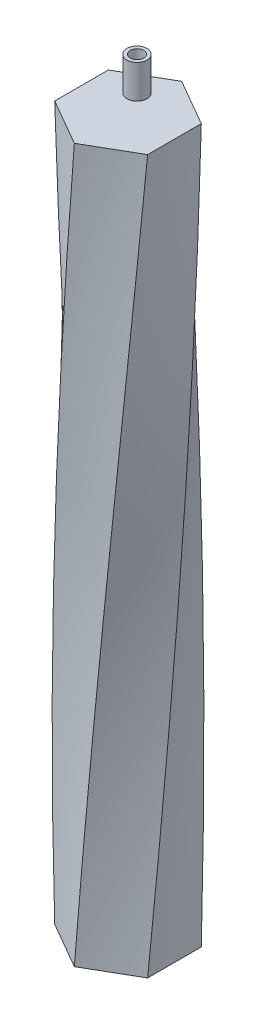
ISO-10303-21;
HEADER;
FILE_DESCRIPTION(('STEP AP214'),'2;1');
FILE_NAME('part.step','',(''),(''),'','','');
FILE_SCHEMA(('AUTOMOTIVE_DESIGN { 1 0 10303 214 1 1 1 1 }'));
ENDSEC;
DATA;
#1=APPLICATION_CONTEXT('core data for automotive mechanical design processes');
#2=APPLICATION_PROTOCOL_DEFINITION('international standard','automotive_design',2000,#1);
#3=PRODUCT_CONTEXT('',#1,'mechanical');
#4=PRODUCT('Part','Part','',(#3));
#5=PRODUCT_RELATED_PRODUCT_CATEGORY('part','',(#4));
#6=PRODUCT_DEFINITION_FORMATION('','',#4);
#7=PRODUCT_DEFINITION_CONTEXT('part definition',#1,'design');
#8=PRODUCT_DEFINITION('design','',#6,#7);
#9=PRODUCT_DEFINITION_SHAPE('','',#8);
#10=(LENGTH_UNIT() NAMED_UNIT(*) SI_UNIT(.MILLI.,.METRE.));
#11=(NAMED_UNIT(*) PLANE_ANGLE_UNIT() SI_UNIT($,.RADIAN.));
#12=(NAMED_UNIT(*) SI_UNIT($,.STERADIAN.) SOLID_ANGLE_UNIT());
#13=UNCERTAINTY_MEASURE_WITH_UNIT(LENGTH_MEASURE(1.E-05),#10,'distance_accuracy_value','');
#14=(GEOMETRIC_REPRESENTATION_CONTEXT(3) GLOBAL_UNCERTAINTY_ASSIGNED_CONTEXT((#13)) GLOBAL_UNIT_ASSIGNED_CONTEXT((#10,
#11,#12)) REPRESENTATION_CONTEXT('',''));
#15=CARTESIAN_POINT('',(0.,0.,0.));
#16=DIRECTION('',(0.,0.,1.));
#17=DIRECTION('',(1.,0.,0.));
#18=AXIS2_PLACEMENT_3D('',#15,#16,#17);
#19=CARTESIAN_POINT('',(0.,0.,0.));
#20=DIRECTION('',(0.,1.,0.));
#21=DIRECTION('',(0.,0.,1.));
#22=AXIS2_PLACEMENT_3D('',#19,#20,#21);
#23=PLANE('',#22);
#24=DIRECTION('',(-0.866025403784441,0.,-0.499999999999995));
#25=VECTOR('',#24,1.);
#26=CARTESIAN_POINT('',(17.5976362048996,0.,-10.1600000000002));
#27=LINE('',#26,#25);
#28=CARTESIAN_POINT('',(17.5976362048996,0.,-10.1600000000002));
#29=VERTEX_POINT('',#28);
#30=CARTESIAN_POINT('',(0.,0.,-20.32));
#31=VERTEX_POINT('',#30);
#32=EDGE_CURVE('E104',#29,#31,#27,.T.);
#33=ORIENTED_EDGE('',*,*,#32,.F.);
#34=DIRECTION('',(0.,0.,-1.));
#35=VECTOR('',#34,1.);
#36=CARTESIAN_POINT('',(17.5976362048999,0.,10.1599999999998));
#37=LINE('',#36,#35);
#38=CARTESIAN_POINT('',(17.5976362048999,0.,10.1599999999998));
#39=VERTEX_POINT('',#38);
#40=EDGE_CURVE('E88',#39,#29,#37,.T.);
#41=ORIENTED_EDGE('',*,*,#40,.F.);
#42=DIRECTION('',(0.866025403784434,0.,-0.500000000000007));
#43=VECTOR('',#42,1.);
#44=CARTESIAN_POINT('',(1.41893801610585E-13,0.,20.32));
#45=LINE('',#44,#43);
#46=CARTESIAN_POINT('',(1.41893801610585E-13,0.,20.32));
#47=VERTEX_POINT('',#46);
#48=EDGE_CURVE('E92',#47,#39,#45,.T.);
#49=ORIENTED_EDGE('',*,*,#48,.F.);
#50=DIRECTION('',(0.866025403784442,0.,0.499999999999995));
#51=VECTOR('',#50,1.);
#52=CARTESIAN_POINT('',(-17.5976362048997,0.,10.1600000000001));
#53=LINE('',#52,#51);
#54=CARTESIAN_POINT('',(-17.5976362048997,0.,10.1600000000001));
#55=VERTEX_POINT('',#54);
#56=EDGE_CURVE('E308',#55,#47,#53,.T.);
#57=ORIENTED_EDGE('',*,*,#56,.F.);
#58=DIRECTION('',(0.,0.,1.));
#59=VECTOR('',#58,1.);
#60=CARTESIAN_POINT('',(-17.5976362048998,0.,-10.1599999999999));
#61=LINE('',#60,#59);
#62=CARTESIAN_POINT('',(-17.5976362048998,0.,-10.1599999999999));
#63=VERTEX_POINT('',#62);
#64=EDGE_CURVE('E233',#63,#55,#61,.T.);
#65=ORIENTED_EDGE('',*,*,#64,.F.);
#66=DIRECTION('',(-0.866025403784438,0.,0.500000000000001));
#67=VECTOR('',#66,1.);
#68=CARTESIAN_POINT('',(0.,0.,-20.32));
#69=LINE('',#68,#67);
#70=EDGE_CURVE('E106',#31,#63,#69,.T.);
#71=ORIENTED_EDGE('',*,*,#70,.F.);
#72=EDGE_LOOP('',(#33,#41,#49,#57,#65,#71));
#73=FACE_BOUND('',#72,.T.);
#74=ADVANCED_FACE('F45',(#73),#23,.F.);
#75=CARTESIAN_POINT('',(0.,270.000000004,0.));
#76=DIRECTION('',(0.,1.,0.));
#77=DIRECTION('',(0.86602540378444,0.,0.499999999999998));
#78=AXIS2_PLACEMENT_3D('',#75,#76,#77);
#79=PLANE('',#78);
#80=CARTESIAN_POINT('',(-4.64754166592762,270.000000004,-8.05005868256937));
#81=DIRECTION('',(0.,1.,0.));
#82=DIRECTION('',(0.,0.,1.));
#83=AXIS2_PLACEMENT_3D('',#80,#81,#82);
#84=CIRCLE('',#83,3.81);
#85=CARTESIAN_POINT('',(-4.64754166592762,270.000000004,-4.24005868256937));
#86=VERTEX_POINT('',#85);
#87=EDGE_CURVE('E322',#86,#86,#84,.T.);
#88=ORIENTED_EDGE('',*,*,#87,.F.);
#89=EDGE_LOOP('',(#88));
#90=FACE_BOUND('',#89,.T.);
#91=DIRECTION('',(-0.866025403784435,0.,0.500000000000007));
#92=VECTOR('',#91,1.);
#93=CARTESIAN_POINT('',(-2.84494650060196E-13,270.000000004,-20.32));
#94=LINE('',#93,#92);
#95=CARTESIAN_POINT('',(0.000279911951962058,270.000015359903,-20.3200095508198));
#96=VERTEX_POINT('',#95);
#97=CARTESIAN_POINT('',(-17.5974784614729,270.000012485194,-10.1602901202237));
#98=VERTEX_POINT('',#97);
#99=EDGE_CURVE('E48',#96,#98,#94,.T.);
#100=ORIENTED_EDGE('',*,*,#99,.T.);
#101=DIRECTION('',(0.,0.,1.));
#102=VECTOR('',#101,1.);
#103=CARTESIAN_POINT('',(-17.5976362048998,270.000000004,-10.1599999999999));
#104=LINE('',#103,#102);
#105=CARTESIAN_POINT('',(-17.5977678857389,270.000015359906,10.1597528115703));
#106=VERTEX_POINT('',#105);
#107=EDGE_CURVE('E201',#98,#106,#104,.T.);
#108=ORIENTED_EDGE('',*,*,#107,.T.);
#109=DIRECTION('',(0.866025403784441,0.,0.499999999999995));
#110=VECTOR('',#109,1.);
#111=CARTESIAN_POINT('',(-17.5976362048997,270.000000004,10.1600000000001));
#112=LINE('',#111,#110);
#113=CARTESIAN_POINT('',(-0.000281958775038333,270.000013398154,20.3200196803198));
#114=VERTEX_POINT('',#113);
#115=EDGE_CURVE('E182',#106,#114,#112,.T.);
#116=ORIENTED_EDGE('',*,*,#115,.T.);
#117=DIRECTION('',(0.866025403784434,0.,-0.500000000000007));
#118=VECTOR('',#117,1.);
#119=CARTESIAN_POINT('',(1.38777878078145E-13,270.000000004,20.32));
#120=LINE('',#119,#118);
#121=CARTESIAN_POINT('',(17.597478461473,270.000012485194,10.1602901202236));
#122=VERTEX_POINT('',#121);
#123=EDGE_CURVE('E216',#114,#122,#120,.T.);
#124=ORIENTED_EDGE('',*,*,#123,.T.);
#125=DIRECTION('',(0.,0.,-1.));
#126=VECTOR('',#125,1.);
#127=CARTESIAN_POINT('',(17.5976362048998,270.000000004,10.1599999999998));
#128=LINE('',#127,#126);
#129=CARTESIAN_POINT('',(17.5977678857388,270.000015359906,-10.1597528115704));
#130=VERTEX_POINT('',#129);
#131=EDGE_CURVE('E63',#122,#130,#128,.T.);
#132=ORIENTED_EDGE('',*,*,#131,.T.);
#133=DIRECTION('',(-0.866025403784445,0.,-0.499999999999989));
#134=VECTOR('',#133,1.);
#135=CARTESIAN_POINT('',(17.5976362048996,270.000000004,-10.1600000000002));
#136=LINE('',#135,#134);
#137=EDGE_CURVE('E11',#130,#96,#136,.T.);
#138=ORIENTED_EDGE('',*,*,#137,.T.);
#139=EDGE_LOOP('',(#100,#108,#116,#124,#132,#138));
#140=FACE_BOUND('',#139,.T.);
#141=ADVANCED_FACE('F145',(#90,#140),#79,.T.);
#142=CARTESIAN_POINT('',(17.5976362048996,0.,-10.1600000000002));
#143=CARTESIAN_POINT('',(16.7980268635615,20.2500000003,-11.5449640054045));
#144=CARTESIAN_POINT('',(15.7916059368055,40.5000000005999,-12.7877903461329));
#145=CARTESIAN_POINT('',(14.7851850100494,60.7500000008999,-14.0306166868612));
#146=CARTESIAN_POINT('',(13.5967339212118,81.0000000011998,-15.1007028537008));
#147=CARTESIAN_POINT('',(12.4082828323742,101.2500000015,-16.1707890205403));
#148=CARTESIAN_POINT('',(11.0670651915051,121.5000000018,-17.0417859406511));
#149=CARTESIAN_POINT('',(9.7258475506361,141.7500000021,-17.9127828607619));
#150=CARTESIAN_POINT('',(8.26488858730003,162.0000000024,-18.5632436992977));
#151=CARTESIAN_POINT('',(6.80392962396395,182.2500000027,-19.2137045378335));
#152=CARTESIAN_POINT('',(5.25920299648298,202.500000003,-19.6276127901939));
#153=CARTESIAN_POINT('',(3.71447636900201,222.750000003299,-20.0415210425542));
#154=CARTESIAN_POINT('',(2.12401837359848,243.000000003599,-20.2086849138833));
#155=CARTESIAN_POINT('',(0.533560378194947,263.250000003899,-20.3758487852123));
#156=CARTESIAN_POINT('',(-1.06346663085685,283.500000004199,-20.2921521462129));
#157=CARTESIAN_POINT('',(-2.66049363990865,303.750000004499,-20.2084555072134));
#158=CARTESIAN_POINT('',(-4.22476555741709,324.000000004799,-19.8759592469108));
#159=CARTESIAN_POINT('',(0.,0.,-20.32));
#160=CARTESIAN_POINT('',(-1.59921868267624,20.2500000003,-20.32));
#161=CARTESIAN_POINT('',(-3.17874832961749,40.5000000005999,-20.0698270808932));
#162=CARTESIAN_POINT('',(-4.75827797655873,60.7500000008999,-19.8196541617864));
#163=CARTESIAN_POINT('',(-6.27922532569892,81.0000000011998,-19.3254684111175));
#164=CARTESIAN_POINT('',(-7.80017267483911,101.2500000015,-18.8312826604486));
#165=CARTESIAN_POINT('',(-9.22508695470757,121.5000000018,-18.1052525715076));
#166=CARTESIAN_POINT('',(-10.650001234576,141.7500000021,-17.3792224825666));
#167=CARTESIAN_POINT('',(-11.943796326583,162.0000000024,-16.4392253256989));
#168=CARTESIAN_POINT('',(-13.23759141859,182.2500000027,-15.4992281688312));
#169=CARTESIAN_POINT('',(-14.3684097937106,202.500000003,-14.3684097937106));
#170=CARTESIAN_POINT('',(-15.4992281688312,222.750000003299,-13.23759141859));
#171=CARTESIAN_POINT('',(-16.4392253256989,243.000000003599,-11.943796326583));
#172=CARTESIAN_POINT('',(-17.3792224825666,263.250000003899,-10.650001234576));
#173=CARTESIAN_POINT('',(-18.1052525715076,283.500000004199,-9.22508695470757));
#174=CARTESIAN_POINT('',(-18.8312826604486,303.750000004499,-7.80017267483912));
#175=CARTESIAN_POINT('',(-19.3254684111175,324.000000004799,-6.27922532569892));
#176=(BOUNDED_SURFACE() B_SPLINE_SURFACE(1,2,((#142,#143,#144,#145,#146,#147,#148,#149,#150,
#151,#152,#153,#154,#155,#156,#157,#158),(#159,#160,#161,#162,#163,#164,#165,#166,#167,#168,
#169,#170,#171,#172,#173,#174,#175)),.UNSPECIFIED.,.F.,.F.,.F.) B_SPLINE_SURFACE_WITH_KNOTS((2,
2),(3,2,2,2,2,2,2,2,3),(0.,1.),(0.,0.125,0.25,0.375,0.5,0.625,0.75,0.875,1.),
.UNSPECIFIED.) GEOMETRIC_REPRESENTATION_ITEM() RATIONAL_B_SPLINE_SURFACE(((1.,0.996917333733128,
1.,0.996917333733128,1.,0.996917333733128,1.,0.996917333733128,1.,0.996917333733128,1.,
0.996917333733128,1.,0.996917333733128,1.,0.996917333733128,1.),(1.,0.996917333733128,1.,
0.996917333733128,1.,0.996917333733128,1.,0.996917333733128,1.,0.996917333733128,1.,
0.996917333733128,1.,0.996917333733128,1.,0.996917333733128,1.))) REPRESENTATION_ITEM('') SURFACE());
#177=CARTESIAN_POINT('',(0.,0.,-20.32));
#178=CARTESIAN_POINT('',(-1.59921868267624,20.2500000003,-20.32));
#179=CARTESIAN_POINT('',(-3.17874832961749,40.5000000005999,-20.0698270808932));
#180=CARTESIAN_POINT('',(-4.75827797655873,60.7500000008999,-19.8196541617864));
#181=CARTESIAN_POINT('',(-6.27922532569892,81.0000000011998,-19.3254684111175));
#182=CARTESIAN_POINT('',(-7.80017267483911,101.2500000015,-18.8312826604486));
#183=CARTESIAN_POINT('',(-9.22508695470757,121.5000000018,-18.1052525715076));
#184=CARTESIAN_POINT('',(-10.650001234576,141.7500000021,-17.3792224825666));
#185=CARTESIAN_POINT('',(-11.943796326583,162.0000000024,-16.4392253256989));
#186=CARTESIAN_POINT('',(-13.23759141859,182.2500000027,-15.4992281688312));
#187=CARTESIAN_POINT('',(-14.3684097937106,202.500000003,-14.3684097937106));
#188=CARTESIAN_POINT('',(-15.4992281688312,222.750000003299,-13.23759141859));
#189=CARTESIAN_POINT('',(-16.4392253256989,243.000000003599,-11.943796326583));
#190=CARTESIAN_POINT('',(-17.3792224825666,263.250000003899,-10.650001234576));
#191=CARTESIAN_POINT('',(-18.1052525715076,283.500000004199,-9.22508695470757));
#192=CARTESIAN_POINT('',(-18.8312826604486,303.750000004499,-7.80017267483912));
#193=CARTESIAN_POINT('',(-19.3254684111175,324.000000004799,-6.27922532569892));
#194=(BOUNDED_CURVE() B_SPLINE_CURVE(2,(#177,#178,#179,#180,#181,#182,#183,#184,#185,#186,#187,
#188,#189,#190,#191,#192,#193),.UNSPECIFIED.,.F.,.F.) B_SPLINE_CURVE_WITH_KNOTS((3,2,2,2,2,2,2,
2,3),(0.,0.125,0.25,0.375,0.5,0.625,0.75,0.875,1.),
.UNSPECIFIED.) CURVE() GEOMETRIC_REPRESENTATION_ITEM() RATIONAL_B_SPLINE_CURVE((1.,
0.996917333733128,1.,0.996917333733128,1.,0.996917333733128,1.,0.996917333733128,1.,
0.996917333733128,1.,0.996917333733128,1.,0.996917333733128,1.,0.996917333733128,1.)) REPRESENTATION_ITEM(''));
#195=EDGE_CURVE('E127',#31,#98,#194,.T.);
#196=CARTESIAN_POINT('',(17.5976362048996,0.,-10.1600000000002));
#197=CARTESIAN_POINT('',(16.7980268635615,20.2500000003,-11.5449640054045));
#198=CARTESIAN_POINT('',(15.7916059368055,40.5000000005999,-12.7877903461329));
#199=CARTESIAN_POINT('',(14.7851850100494,60.7500000008999,-14.0306166868612));
#200=CARTESIAN_POINT('',(13.5967339212118,81.0000000011998,-15.1007028537008));
#201=CARTESIAN_POINT('',(12.4082828323742,101.2500000015,-16.1707890205403));
#202=CARTESIAN_POINT('',(11.0670651915051,121.5000000018,-17.0417859406511));
#203=CARTESIAN_POINT('',(9.7258475506361,141.7500000021,-17.9127828607619));
#204=CARTESIAN_POINT('',(8.26488858730003,162.0000000024,-18.5632436992977));
#205=CARTESIAN_POINT('',(6.80392962396395,182.2500000027,-19.2137045378335));
#206=CARTESIAN_POINT('',(5.25920299648298,202.500000003,-19.6276127901939));
#207=CARTESIAN_POINT('',(3.71447636900201,222.750000003299,-20.0415210425542));
#208=CARTESIAN_POINT('',(2.12401837359848,243.000000003599,-20.2086849138833));
#209=CARTESIAN_POINT('',(0.533560378194947,263.250000003899,-20.3758487852123));
#210=CARTESIAN_POINT('',(-1.06346663085685,283.500000004199,-20.2921521462129));
#211=CARTESIAN_POINT('',(-2.66049363990865,303.750000004499,-20.2084555072134));
#212=CARTESIAN_POINT('',(-4.22476555741709,324.000000004799,-19.8759592469108));
#213=(BOUNDED_CURVE() B_SPLINE_CURVE(2,(#196,#197,#198,#199,#200,#201,#202,#203,#204,#205,#206,
#207,#208,#209,#210,#211,#212),.UNSPECIFIED.,.F.,.F.) B_SPLINE_CURVE_WITH_KNOTS((3,2,2,2,2,2,2,
2,3),(0.,0.125,0.25,0.375,0.5,0.625,0.75,0.875,1.),
.UNSPECIFIED.) CURVE() GEOMETRIC_REPRESENTATION_ITEM() RATIONAL_B_SPLINE_CURVE((1.,
0.996917333733128,1.,0.996917333733128,1.,0.996917333733128,1.,0.996917333733128,1.,
0.996917333733128,1.,0.996917333733128,1.,0.996917333733128,1.,0.996917333733128,1.)) REPRESENTATION_ITEM(''));
#214=EDGE_CURVE('E118',#29,#96,#213,.T.);
#215=ORIENTED_EDGE('',*,*,#195,.T.);
#216=ORIENTED_EDGE('',*,*,#99,.F.);
#217=ORIENTED_EDGE('',*,*,#214,.F.);
#218=ORIENTED_EDGE('',*,*,#32,.T.);
#219=EDGE_LOOP('',(#215,#216,#217,#218));
#220=FACE_BOUND('',#219,.T.);
#221=ADVANCED_FACE('F122',(#220),#176,.T.);
#222=CARTESIAN_POINT('',(0.,0.,-20.32));
#223=CARTESIAN_POINT('',(-1.59921868267624,20.2500000003,-20.32));
#224=CARTESIAN_POINT('',(-3.17874832961749,40.5000000005999,-20.0698270808932));
#225=CARTESIAN_POINT('',(-4.75827797655873,60.7500000008999,-19.8196541617864));
#226=CARTESIAN_POINT('',(-6.27922532569892,81.0000000011998,-19.3254684111175));
#227=CARTESIAN_POINT('',(-7.80017267483911,101.2500000015,-18.8312826604486));
#228=CARTESIAN_POINT('',(-9.22508695470757,121.5000000018,-18.1052525715076));
#229=CARTESIAN_POINT('',(-10.650001234576,141.7500000021,-17.3792224825666));
#230=CARTESIAN_POINT('',(-11.943796326583,162.0000000024,-16.4392253256989));
#231=CARTESIAN_POINT('',(-13.23759141859,182.2500000027,-15.4992281688312));
#232=CARTESIAN_POINT('',(-14.3684097937106,202.500000003,-14.3684097937106));
#233=CARTESIAN_POINT('',(-15.4992281688312,222.750000003299,-13.23759141859));
#234=CARTESIAN_POINT('',(-16.4392253256989,243.000000003599,-11.943796326583));
#235=CARTESIAN_POINT('',(-17.3792224825666,263.250000003899,-10.650001234576));
#236=CARTESIAN_POINT('',(-18.1052525715076,283.500000004199,-9.22508695470757));
#237=CARTESIAN_POINT('',(-18.8312826604486,303.750000004499,-7.80017267483912));
#238=CARTESIAN_POINT('',(-19.3254684111175,324.000000004799,-6.27922532569892));
#239=CARTESIAN_POINT('',(-17.5976362048998,0.,-10.1599999999999));
#240=CARTESIAN_POINT('',(-18.3972455462379,20.2500000003,-8.77503599459562));
#241=CARTESIAN_POINT('',(-18.9703542664231,40.5000000005999,-7.28203673476045));
#242=CARTESIAN_POINT('',(-19.5434629866083,60.7500000008999,-5.78903747492526));
#243=CARTESIAN_POINT('',(-19.8759592469109,81.0000000011998,-4.22476555741682));
#244=CARTESIAN_POINT('',(-20.2084555072135,101.2500000015,-2.66049363990837));
#245=CARTESIAN_POINT('',(-20.2921521462129,121.5000000018,-1.06346663085657));
#246=CARTESIAN_POINT('',(-20.3758487852123,141.7500000021,0.533560378195228));
#247=CARTESIAN_POINT('',(-20.2086849138833,162.0000000024,2.12401837359876));
#248=CARTESIAN_POINT('',(-20.0415210425542,182.2500000027,3.71447636900229));
#249=CARTESIAN_POINT('',(-19.6276127901938,202.500000003,5.25920299648326));
#250=CARTESIAN_POINT('',(-19.2137045378334,222.750000003299,6.80392962396422));
#251=CARTESIAN_POINT('',(-18.5632436992976,243.000000003599,8.26488858730029));
#252=CARTESIAN_POINT('',(-17.9127828607618,263.250000003899,9.72584755063635));
#253=CARTESIAN_POINT('',(-17.041785940651,283.500000004199,11.0670651915054));
#254=CARTESIAN_POINT('',(-16.1707890205402,303.750000004499,12.4082828323744));
#255=CARTESIAN_POINT('',(-15.1007028537006,324.000000004799,13.596733921212));
#256=(BOUNDED_SURFACE() B_SPLINE_SURFACE(1,2,((#222,#223,#224,#225,#226,#227,#228,#229,#230,
#231,#232,#233,#234,#235,#236,#237,#238),(#239,#240,#241,#242,#243,#244,#245,#246,#247,#248,
#249,#250,#251,#252,#253,#254,#255)),.UNSPECIFIED.,.F.,.F.,.F.) B_SPLINE_SURFACE_WITH_KNOTS((2,
2),(3,2,2,2,2,2,2,2,3),(0.,1.),(0.,0.125,0.25,0.375,0.5,0.625,0.75,0.875,1.),
.UNSPECIFIED.) GEOMETRIC_REPRESENTATION_ITEM() RATIONAL_B_SPLINE_SURFACE(((1.,0.996917333733128,
1.,0.996917333733128,1.,0.996917333733128,1.,0.996917333733128,1.,0.996917333733128,1.,
0.996917333733128,1.,0.996917333733128,1.,0.996917333733128,1.),(1.,0.996917333733128,1.,
0.996917333733128,1.,0.996917333733128,1.,0.996917333733128,1.,0.996917333733128,1.,
0.996917333733128,1.,0.996917333733128,1.,0.996917333733128,1.))) REPRESENTATION_ITEM('') SURFACE());
#257=CARTESIAN_POINT('',(-17.5976362048998,0.,-10.1599999999999));
#258=CARTESIAN_POINT('',(-18.3972455462379,20.2500000003,-8.77503599459562));
#259=CARTESIAN_POINT('',(-18.9703542664231,40.5000000005999,-7.28203673476045));
#260=CARTESIAN_POINT('',(-19.5434629866083,60.7500000008999,-5.78903747492526));
#261=CARTESIAN_POINT('',(-19.8759592469109,81.0000000011998,-4.22476555741682));
#262=CARTESIAN_POINT('',(-20.2084555072135,101.2500000015,-2.66049363990837));
#263=CARTESIAN_POINT('',(-20.2921521462129,121.5000000018,-1.06346663085657));
#264=CARTESIAN_POINT('',(-20.3758487852123,141.7500000021,0.533560378195228));
#265=CARTESIAN_POINT('',(-20.2086849138833,162.0000000024,2.12401837359876));
#266=CARTESIAN_POINT('',(-20.0415210425542,182.2500000027,3.71447636900229));
#267=CARTESIAN_POINT('',(-19.6276127901938,202.500000003,5.25920299648326));
#268=CARTESIAN_POINT('',(-19.2137045378334,222.750000003299,6.80392962396422));
#269=CARTESIAN_POINT('',(-18.5632436992976,243.000000003599,8.26488858730029));
#270=CARTESIAN_POINT('',(-17.9127828607618,263.250000003899,9.72584755063635));
#271=CARTESIAN_POINT('',(-17.041785940651,283.500000004199,11.0670651915054));
#272=CARTESIAN_POINT('',(-16.1707890205402,303.750000004499,12.4082828323744));
#273=CARTESIAN_POINT('',(-15.1007028537006,324.000000004799,13.596733921212));
#274=(BOUNDED_CURVE() B_SPLINE_CURVE(2,(#257,#258,#259,#260,#261,#262,#263,#264,#265,#266,#267,
#268,#269,#270,#271,#272,#273),.UNSPECIFIED.,.F.,.F.) B_SPLINE_CURVE_WITH_KNOTS((3,2,2,2,2,2,2,
2,3),(0.,0.125,0.25,0.375,0.5,0.625,0.75,0.875,1.),
.UNSPECIFIED.) CURVE() GEOMETRIC_REPRESENTATION_ITEM() RATIONAL_B_SPLINE_CURVE((1.,
0.996917333733128,1.,0.996917333733128,1.,0.996917333733128,1.,0.996917333733128,1.,
0.996917333733128,1.,0.996917333733128,1.,0.996917333733128,1.,0.996917333733128,1.)) REPRESENTATION_ITEM(''));
#275=EDGE_CURVE('E191',#63,#106,#274,.T.);
#276=ORIENTED_EDGE('',*,*,#275,.T.);
#277=ORIENTED_EDGE('',*,*,#107,.F.);
#278=ORIENTED_EDGE('',*,*,#195,.F.);
#279=ORIENTED_EDGE('',*,*,#70,.T.);
#280=EDGE_LOOP('',(#276,#277,#278,#279));
#281=FACE_BOUND('',#280,.T.);
#282=ADVANCED_FACE('F261',(#281),#256,.T.);
#283=CARTESIAN_POINT('',(-17.5976362048998,0.,-10.1599999999999));
#284=CARTESIAN_POINT('',(-18.3972455462379,20.2500000003,-8.77503599459562));
#285=CARTESIAN_POINT('',(-18.9703542664231,40.5000000005999,-7.28203673476045));
#286=CARTESIAN_POINT('',(-19.5434629866083,60.7500000008999,-5.78903747492526));
#287=CARTESIAN_POINT('',(-19.8759592469109,81.0000000011998,-4.22476555741682));
#288=CARTESIAN_POINT('',(-20.2084555072135,101.2500000015,-2.66049363990837));
#289=CARTESIAN_POINT('',(-20.2921521462129,121.5000000018,-1.06346663085657));
#290=CARTESIAN_POINT('',(-20.3758487852123,141.7500000021,0.533560378195228));
#291=CARTESIAN_POINT('',(-20.2086849138833,162.0000000024,2.12401837359876));
#292=CARTESIAN_POINT('',(-20.0415210425542,182.2500000027,3.71447636900229));
#293=CARTESIAN_POINT('',(-19.6276127901938,202.500000003,5.25920299648326));
#294=CARTESIAN_POINT('',(-19.2137045378334,222.750000003299,6.80392962396422));
#295=CARTESIAN_POINT('',(-18.5632436992976,243.000000003599,8.26488858730029));
#296=CARTESIAN_POINT('',(-17.9127828607618,263.250000003899,9.72584755063635));
#297=CARTESIAN_POINT('',(-17.041785940651,283.500000004199,11.0670651915054));
#298=CARTESIAN_POINT('',(-16.1707890205402,303.750000004499,12.4082828323744));
#299=CARTESIAN_POINT('',(-15.1007028537006,324.000000004799,13.596733921212));
#300=CARTESIAN_POINT('',(-17.5976362048997,0.,10.1600000000001));
#301=CARTESIAN_POINT('',(-16.7980268635616,20.2500000003,11.5449640054044));
#302=CARTESIAN_POINT('',(-15.7916059368056,40.5000000005999,12.7877903461327));
#303=CARTESIAN_POINT('',(-14.7851850100495,60.7500000008999,14.0306166868611));
#304=CARTESIAN_POINT('',(-13.5967339212119,81.0000000011998,15.1007028537007));
#305=CARTESIAN_POINT('',(-12.4082828323743,101.2500000015,16.1707890205402));
#306=CARTESIAN_POINT('',(-11.0670651915053,121.5000000018,17.041785940651));
#307=CARTESIAN_POINT('',(-9.72584755063623,141.7500000021,17.9127828607618));
#308=CARTESIAN_POINT('',(-8.26488858730016,162.0000000024,18.5632436992977));
#309=CARTESIAN_POINT('',(-6.80392962396409,182.2500000027,19.2137045378335));
#310=CARTESIAN_POINT('',(-5.25920299648312,202.500000003,19.6276127901939));
#311=CARTESIAN_POINT('',(-3.71447636900216,222.750000003299,20.0415210425542));
#312=CARTESIAN_POINT('',(-2.12401837359862,243.000000003599,20.2086849138833));
#313=CARTESIAN_POINT('',(-0.533560378195091,263.250000003899,20.3758487852123));
#314=CARTESIAN_POINT('',(1.06346663085671,283.500000004199,20.2921521462129));
#315=CARTESIAN_POINT('',(2.66049363990851,303.750000004499,20.2084555072135));
#316=CARTESIAN_POINT('',(4.22476555741695,324.000000004799,19.8759592469109));
#317=(BOUNDED_SURFACE() B_SPLINE_SURFACE(1,2,((#283,#284,#285,#286,#287,#288,#289,#290,#291,
#292,#293,#294,#295,#296,#297,#298,#299),(#300,#301,#302,#303,#304,#305,#306,#307,#308,#309,
#310,#311,#312,#313,#314,#315,#316)),.UNSPECIFIED.,.F.,.F.,.F.) B_SPLINE_SURFACE_WITH_KNOTS((2,
2),(3,2,2,2,2,2,2,2,3),(0.,1.),(0.,0.125,0.25,0.375,0.5,0.625,0.75,0.875,1.),
.UNSPECIFIED.) GEOMETRIC_REPRESENTATION_ITEM() RATIONAL_B_SPLINE_SURFACE(((1.,0.996917333733128,
1.,0.996917333733128,1.,0.996917333733128,1.,0.996917333733128,1.,0.996917333733128,1.,
0.996917333733128,1.,0.996917333733128,1.,0.996917333733128,1.),(1.,0.996917333733128,1.,
0.996917333733128,1.,0.996917333733128,1.,0.996917333733128,1.,0.996917333733128,1.,
0.996917333733128,1.,0.996917333733128,1.,0.996917333733128,1.))) REPRESENTATION_ITEM('') SURFACE());
#318=CARTESIAN_POINT('',(-17.5976362048997,0.,10.1600000000001));
#319=CARTESIAN_POINT('',(-16.7980268635616,20.2500000003,11.5449640054044));
#320=CARTESIAN_POINT('',(-15.7916059368056,40.5000000005999,12.7877903461327));
#321=CARTESIAN_POINT('',(-14.7851850100495,60.7500000008999,14.0306166868611));
#322=CARTESIAN_POINT('',(-13.5967339212119,81.0000000011998,15.1007028537007));
#323=CARTESIAN_POINT('',(-12.4082828323743,101.2500000015,16.1707890205402));
#324=CARTESIAN_POINT('',(-11.0670651915053,121.5000000018,17.041785940651));
#325=CARTESIAN_POINT('',(-9.72584755063623,141.7500000021,17.9127828607618));
#326=CARTESIAN_POINT('',(-8.26488858730016,162.0000000024,18.5632436992977));
#327=CARTESIAN_POINT('',(-6.80392962396409,182.2500000027,19.2137045378335));
#328=CARTESIAN_POINT('',(-5.25920299648312,202.500000003,19.6276127901939));
#329=CARTESIAN_POINT('',(-3.71447636900216,222.750000003299,20.0415210425542));
#330=CARTESIAN_POINT('',(-2.12401837359862,243.000000003599,20.2086849138833));
#331=CARTESIAN_POINT('',(-0.533560378195091,263.250000003899,20.3758487852123));
#332=CARTESIAN_POINT('',(1.06346663085671,283.500000004199,20.2921521462129));
#333=CARTESIAN_POINT('',(2.66049363990851,303.750000004499,20.2084555072135));
#334=CARTESIAN_POINT('',(4.22476555741695,324.000000004799,19.8759592469109));
#335=(BOUNDED_CURVE() B_SPLINE_CURVE(2,(#318,#319,#320,#321,#322,#323,#324,#325,#326,#327,#328,
#329,#330,#331,#332,#333,#334),.UNSPECIFIED.,.F.,.F.) B_SPLINE_CURVE_WITH_KNOTS((3,2,2,2,2,2,2,
2,3),(0.,0.125,0.25,0.375,0.5,0.625,0.75,0.875,1.),
.UNSPECIFIED.) CURVE() GEOMETRIC_REPRESENTATION_ITEM() RATIONAL_B_SPLINE_CURVE((1.,
0.996917333733128,1.,0.996917333733128,1.,0.996917333733128,1.,0.996917333733128,1.,
0.996917333733128,1.,0.996917333733128,1.,0.996917333733128,1.,0.996917333733128,1.)) REPRESENTATION_ITEM(''));
#336=EDGE_CURVE('E190',#55,#114,#335,.T.);
#337=ORIENTED_EDGE('',*,*,#336,.T.);
#338=ORIENTED_EDGE('',*,*,#115,.F.);
#339=ORIENTED_EDGE('',*,*,#275,.F.);
#340=ORIENTED_EDGE('',*,*,#64,.T.);
#341=EDGE_LOOP('',(#337,#338,#339,#340));
#342=FACE_BOUND('',#341,.T.);
#343=ADVANCED_FACE('F232',(#342),#317,.T.);
#344=CARTESIAN_POINT('',(-17.5976362048997,0.,10.1600000000001));
#345=CARTESIAN_POINT('',(-16.7980268635616,20.2500000003,11.5449640054044));
#346=CARTESIAN_POINT('',(-15.7916059368056,40.5000000005999,12.7877903461327));
#347=CARTESIAN_POINT('',(-14.7851850100495,60.7500000008999,14.0306166868611));
#348=CARTESIAN_POINT('',(-13.5967339212119,81.0000000011998,15.1007028537007));
#349=CARTESIAN_POINT('',(-12.4082828323743,101.2500000015,16.1707890205402));
#350=CARTESIAN_POINT('',(-11.0670651915053,121.5000000018,17.041785940651));
#351=CARTESIAN_POINT('',(-9.72584755063623,141.7500000021,17.9127828607618));
#352=CARTESIAN_POINT('',(-8.26488858730016,162.0000000024,18.5632436992977));
#353=CARTESIAN_POINT('',(-6.80392962396409,182.2500000027,19.2137045378335));
#354=CARTESIAN_POINT('',(-5.25920299648312,202.500000003,19.6276127901939));
#355=CARTESIAN_POINT('',(-3.71447636900216,222.750000003299,20.0415210425542));
#356=CARTESIAN_POINT('',(-2.12401837359862,243.000000003599,20.2086849138833));
#357=CARTESIAN_POINT('',(-0.533560378195091,263.250000003899,20.3758487852123));
#358=CARTESIAN_POINT('',(1.06346663085671,283.500000004199,20.2921521462129));
#359=CARTESIAN_POINT('',(2.66049363990851,303.750000004499,20.2084555072135));
#360=CARTESIAN_POINT('',(4.22476555741695,324.000000004799,19.8759592469109));
#361=CARTESIAN_POINT('',(1.42247325030098E-13,0.,20.32));
#362=CARTESIAN_POINT('',(1.59921868267639,20.2500000003,20.32));
#363=CARTESIAN_POINT('',(3.17874832961763,40.5000000005999,20.0698270808931));
#364=CARTESIAN_POINT('',(4.75827797655887,60.7500000008999,19.8196541617863));
#365=CARTESIAN_POINT('',(6.27922532569905,81.0000000011998,19.3254684111174));
#366=CARTESIAN_POINT('',(7.80017267483924,101.2500000015,18.8312826604486));
#367=CARTESIAN_POINT('',(9.2250869547077,121.5000000018,18.1052525715075));
#368=CARTESIAN_POINT('',(10.6500012345762,141.7500000021,17.3792224825665));
#369=CARTESIAN_POINT('',(11.9437963265831,162.0000000024,16.4392253256988));
#370=CARTESIAN_POINT('',(13.2375914185901,182.2500000027,15.4992281688311));
#371=CARTESIAN_POINT('',(14.3684097937107,202.500000003,14.3684097937105));
#372=CARTESIAN_POINT('',(15.4992281688313,222.750000003299,13.2375914185899));
#373=CARTESIAN_POINT('',(16.439225325699,243.000000003599,11.9437963265829));
#374=CARTESIAN_POINT('',(17.3792224825667,263.250000003899,10.6500012345759));
#375=CARTESIAN_POINT('',(18.1052525715077,283.500000004199,9.22508695470744));
#376=CARTESIAN_POINT('',(18.8312826604487,303.750000004499,7.80017267483898));
#377=CARTESIAN_POINT('',(19.3254684111175,324.000000004799,6.27922532569878));
#378=(BOUNDED_SURFACE() B_SPLINE_SURFACE(1,2,((#344,#345,#346,#347,#348,#349,#350,#351,#352,
#353,#354,#355,#356,#357,#358,#359,#360),(#361,#362,#363,#364,#365,#366,#367,#368,#369,#370,
#371,#372,#373,#374,#375,#376,#377)),.UNSPECIFIED.,.F.,.F.,.F.) B_SPLINE_SURFACE_WITH_KNOTS((2,
2),(3,2,2,2,2,2,2,2,3),(0.,1.),(0.,0.125,0.25,0.375,0.5,0.625,0.75,0.875,1.),
.UNSPECIFIED.) GEOMETRIC_REPRESENTATION_ITEM() RATIONAL_B_SPLINE_SURFACE(((1.,0.996917333733128,
1.,0.996917333733128,1.,0.996917333733128,1.,0.996917333733128,1.,0.996917333733128,1.,
0.996917333733128,1.,0.996917333733128,1.,0.996917333733128,1.),(1.,0.996917333733128,1.,
0.996917333733128,1.,0.996917333733128,1.,0.996917333733128,1.,0.996917333733128,1.,
0.996917333733128,1.,0.996917333733128,1.,0.996917333733128,1.))) REPRESENTATION_ITEM('') SURFACE());
#379=CARTESIAN_POINT('',(1.41893801610585E-13,0.,20.32));
#380=CARTESIAN_POINT('',(1.59921868267639,20.2500000003,20.32));
#381=CARTESIAN_POINT('',(3.17874832961763,40.5000000005999,20.0698270808931));
#382=CARTESIAN_POINT('',(4.75827797655887,60.7500000008999,19.8196541617863));
#383=CARTESIAN_POINT('',(6.27922532569905,81.0000000011998,19.3254684111174));
#384=CARTESIAN_POINT('',(7.80017267483924,101.2500000015,18.8312826604486));
#385=CARTESIAN_POINT('',(9.2250869547077,121.5000000018,18.1052525715075));
#386=CARTESIAN_POINT('',(10.6500012345762,141.7500000021,17.3792224825665));
#387=CARTESIAN_POINT('',(11.9437963265831,162.0000000024,16.4392253256988));
#388=CARTESIAN_POINT('',(13.2375914185901,182.2500000027,15.4992281688311));
#389=CARTESIAN_POINT('',(14.3684097937107,202.500000003,14.3684097937105));
#390=CARTESIAN_POINT('',(15.4992281688313,222.750000003299,13.2375914185899));
#391=CARTESIAN_POINT('',(16.439225325699,243.000000003599,11.9437963265829));
#392=CARTESIAN_POINT('',(17.3792224825667,263.250000003899,10.6500012345759));
#393=CARTESIAN_POINT('',(18.1052525715077,283.500000004199,9.22508695470744));
#394=CARTESIAN_POINT('',(18.8312826604487,303.750000004499,7.80017267483898));
#395=CARTESIAN_POINT('',(19.3254684111175,324.000000004799,6.27922532569878));
#396=(BOUNDED_CURVE() B_SPLINE_CURVE(2,(#379,#380,#381,#382,#383,#384,#385,#386,#387,#388,#389,
#390,#391,#392,#393,#394,#395),.UNSPECIFIED.,.F.,.F.) B_SPLINE_CURVE_WITH_KNOTS((3,2,2,2,2,2,2,
2,3),(0.,0.125,0.25,0.375,0.5,0.625,0.75,0.875,1.),
.UNSPECIFIED.) CURVE() GEOMETRIC_REPRESENTATION_ITEM() RATIONAL_B_SPLINE_CURVE((1.,
0.996917333733128,1.,0.996917333733128,1.,0.996917333733128,1.,0.996917333733128,1.,
0.996917333733128,1.,0.996917333733128,1.,0.996917333733128,1.,0.996917333733128,1.)) REPRESENTATION_ITEM(''));
#397=EDGE_CURVE('E213',#47,#122,#396,.T.);
#398=ORIENTED_EDGE('',*,*,#397,.T.);
#399=ORIENTED_EDGE('',*,*,#123,.F.);
#400=ORIENTED_EDGE('',*,*,#336,.F.);
#401=ORIENTED_EDGE('',*,*,#56,.T.);
#402=EDGE_LOOP('',(#398,#399,#400,#401));
#403=FACE_BOUND('',#402,.T.);
#404=ADVANCED_FACE('F226',(#403),#378,.T.);
#405=CARTESIAN_POINT('',(1.41893801610585E-13,0.,20.32));
#406=CARTESIAN_POINT('',(1.59921868267639,20.2500000003,20.32));
#407=CARTESIAN_POINT('',(3.17874832961763,40.5000000005999,20.0698270808931));
#408=CARTESIAN_POINT('',(4.75827797655887,60.7500000008999,19.8196541617863));
#409=CARTESIAN_POINT('',(6.27922532569905,81.0000000011998,19.3254684111174));
#410=CARTESIAN_POINT('',(7.80017267483924,101.2500000015,18.8312826604486));
#411=CARTESIAN_POINT('',(9.2250869547077,121.5000000018,18.1052525715075));
#412=CARTESIAN_POINT('',(10.6500012345762,141.7500000021,17.3792224825665));
#413=CARTESIAN_POINT('',(11.9437963265831,162.0000000024,16.4392253256988));
#414=CARTESIAN_POINT('',(13.2375914185901,182.2500000027,15.4992281688311));
#415=CARTESIAN_POINT('',(14.3684097937107,202.500000003,14.3684097937105));
#416=CARTESIAN_POINT('',(15.4992281688313,222.750000003299,13.2375914185899));
#417=CARTESIAN_POINT('',(16.439225325699,243.000000003599,11.9437963265829));
#418=CARTESIAN_POINT('',(17.3792224825667,263.250000003899,10.6500012345759));
#419=CARTESIAN_POINT('',(18.1052525715077,283.500000004199,9.22508695470744));
#420=CARTESIAN_POINT('',(18.8312826604487,303.750000004499,7.80017267483898));
#421=CARTESIAN_POINT('',(19.3254684111175,324.000000004799,6.27922532569878));
#422=CARTESIAN_POINT('',(17.5976362048998,0.,10.1599999999998));
#423=CARTESIAN_POINT('',(18.397245546238,20.2500000003,8.7750359945955));
#424=CARTESIAN_POINT('',(18.9703542664232,40.5000000005999,7.28203673476031));
#425=CARTESIAN_POINT('',(19.5434629866084,60.7500000008999,5.78903747492513));
#426=CARTESIAN_POINT('',(19.8759592469109,81.0000000011998,4.22476555741668));
#427=CARTESIAN_POINT('',(20.2084555072135,101.2500000015,2.66049363990823));
#428=CARTESIAN_POINT('',(20.2921521462129,121.5000000018,1.06346663085643));
#429=CARTESIAN_POINT('',(20.3758487852123,141.7500000021,-0.533560378195368));
#430=CARTESIAN_POINT('',(20.2086849138832,162.0000000024,-2.1240183735989));
#431=CARTESIAN_POINT('',(20.0415210425542,182.2500000027,-3.71447636900243));
#432=CARTESIAN_POINT('',(19.6276127901938,202.500000003,-5.25920299648339));
#433=CARTESIAN_POINT('',(19.2137045378334,222.750000003299,-6.80392962396435));
#434=CARTESIAN_POINT('',(18.5632436992975,243.000000003599,-8.26488858730041));
#435=CARTESIAN_POINT('',(17.9127828607617,263.250000003899,-9.72584755063647));
#436=CARTESIAN_POINT('',(17.0417859406509,283.500000004199,-11.0670651915055));
#437=CARTESIAN_POINT('',(16.1707890205401,303.750000004499,-12.4082828323745));
#438=CARTESIAN_POINT('',(15.1007028537005,324.000000004799,-13.5967339212121));
#439=(BOUNDED_SURFACE() B_SPLINE_SURFACE(1,2,((#405,#406,#407,#408,#409,#410,#411,#412,#413,
#414,#415,#416,#417,#418,#419,#420,#421),(#422,#423,#424,#425,#426,#427,#428,#429,#430,#431,
#432,#433,#434,#435,#436,#437,#438)),.UNSPECIFIED.,.F.,.F.,.F.) B_SPLINE_SURFACE_WITH_KNOTS((2,
2),(3,2,2,2,2,2,2,2,3),(0.,1.),(0.,0.125,0.25,0.375,0.5,0.625,0.75,0.875,1.),
.UNSPECIFIED.) GEOMETRIC_REPRESENTATION_ITEM() RATIONAL_B_SPLINE_SURFACE(((1.,0.996917333733128,
1.,0.996917333733128,1.,0.996917333733128,1.,0.996917333733128,1.,0.996917333733128,1.,
0.996917333733128,1.,0.996917333733128,1.,0.996917333733128,1.),(1.,0.996917333733128,1.,
0.996917333733128,1.,0.996917333733128,1.,0.996917333733128,1.,0.996917333733128,1.,
0.996917333733128,1.,0.996917333733128,1.,0.996917333733128,1.))) REPRESENTATION_ITEM('') SURFACE());
#440=CARTESIAN_POINT('',(17.5976362048999,0.,10.1599999999998));
#441=CARTESIAN_POINT('',(18.397245546238,20.2500000003,8.7750359945955));
#442=CARTESIAN_POINT('',(18.9703542664232,40.5000000005999,7.28203673476031));
#443=CARTESIAN_POINT('',(19.5434629866084,60.7500000008999,5.78903747492512));
#444=CARTESIAN_POINT('',(19.8759592469109,81.0000000011998,4.22476555741668));
#445=CARTESIAN_POINT('',(20.2084555072135,101.2500000015,2.66049363990823));
#446=CARTESIAN_POINT('',(20.2921521462129,121.5000000018,1.06346663085643));
#447=CARTESIAN_POINT('',(20.3758487852123,141.7500000021,-0.53356037819537));
#448=CARTESIAN_POINT('',(20.2086849138833,162.0000000024,-2.1240183735989));
#449=CARTESIAN_POINT('',(20.0415210425542,182.2500000027,-3.71447636900243));
#450=CARTESIAN_POINT('',(19.6276127901938,202.500000003,-5.2592029964834));
#451=CARTESIAN_POINT('',(19.2137045378334,222.750000003299,-6.80392962396435));
#452=CARTESIAN_POINT('',(18.5632436992975,243.000000003599,-8.26488858730042));
#453=CARTESIAN_POINT('',(17.9127828607617,263.250000003899,-9.72584755063648));
#454=CARTESIAN_POINT('',(17.0417859406509,283.500000004199,-11.0670651915055));
#455=CARTESIAN_POINT('',(16.1707890205401,303.750000004499,-12.4082828323745));
#456=CARTESIAN_POINT('',(15.1007028537005,324.000000004799,-13.5967339212121));
#457=(BOUNDED_CURVE() B_SPLINE_CURVE(2,(#440,#441,#442,#443,#444,#445,#446,#447,#448,#449,#450,
#451,#452,#453,#454,#455,#456),.UNSPECIFIED.,.F.,.F.) B_SPLINE_CURVE_WITH_KNOTS((3,2,2,2,2,2,2,
2,3),(0.,0.125,0.25,0.375,0.5,0.625,0.75,0.875,1.),
.UNSPECIFIED.) CURVE() GEOMETRIC_REPRESENTATION_ITEM() RATIONAL_B_SPLINE_CURVE((1.,
0.996917333733128,1.,0.996917333733128,1.,0.996917333733128,1.,0.996917333733128,1.,
0.996917333733128,1.,0.996917333733128,1.,0.996917333733128,1.,0.996917333733128,1.)) REPRESENTATION_ITEM(''));
#458=EDGE_CURVE('E56',#39,#130,#457,.T.);
#459=ORIENTED_EDGE('',*,*,#458,.T.);
#460=ORIENTED_EDGE('',*,*,#131,.F.);
#461=ORIENTED_EDGE('',*,*,#397,.F.);
#462=ORIENTED_EDGE('',*,*,#48,.T.);
#463=EDGE_LOOP('',(#459,#460,#461,#462));
#464=FACE_BOUND('',#463,.T.);
#465=ADVANCED_FACE('F358',(#464),#439,.T.);
#466=CARTESIAN_POINT('',(17.5976362048999,0.,10.1599999999998));
#467=CARTESIAN_POINT('',(18.397245546238,20.2500000003,8.7750359945955));
#468=CARTESIAN_POINT('',(18.9703542664232,40.5000000005999,7.28203673476031));
#469=CARTESIAN_POINT('',(19.5434629866084,60.7500000008999,5.78903747492512));
#470=CARTESIAN_POINT('',(19.8759592469109,81.0000000011998,4.22476555741668));
#471=CARTESIAN_POINT('',(20.2084555072135,101.2500000015,2.66049363990823));
#472=CARTESIAN_POINT('',(20.2921521462129,121.5000000018,1.06346663085643));
#473=CARTESIAN_POINT('',(20.3758487852123,141.7500000021,-0.53356037819537));
#474=CARTESIAN_POINT('',(20.2086849138833,162.0000000024,-2.1240183735989));
#475=CARTESIAN_POINT('',(20.0415210425542,182.2500000027,-3.71447636900243));
#476=CARTESIAN_POINT('',(19.6276127901938,202.500000003,-5.2592029964834));
#477=CARTESIAN_POINT('',(19.2137045378334,222.750000003299,-6.80392962396435));
#478=CARTESIAN_POINT('',(18.5632436992975,243.000000003599,-8.26488858730042));
#479=CARTESIAN_POINT('',(17.9127828607617,263.250000003899,-9.72584755063648));
#480=CARTESIAN_POINT('',(17.0417859406509,283.500000004199,-11.0670651915055));
#481=CARTESIAN_POINT('',(16.1707890205401,303.750000004499,-12.4082828323745));
#482=CARTESIAN_POINT('',(15.1007028537005,324.000000004799,-13.5967339212121));
#483=CARTESIAN_POINT('',(17.5976362048996,0.,-10.1600000000002));
#484=CARTESIAN_POINT('',(16.7980268635615,20.2500000003,-11.5449640054045));
#485=CARTESIAN_POINT('',(15.7916059368055,40.5000000005999,-12.7877903461329));
#486=CARTESIAN_POINT('',(14.7851850100494,60.7500000008999,-14.0306166868612));
#487=CARTESIAN_POINT('',(13.5967339212118,81.0000000011998,-15.1007028537008));
#488=CARTESIAN_POINT('',(12.4082828323742,101.2500000015,-16.1707890205403));
#489=CARTESIAN_POINT('',(11.0670651915051,121.5000000018,-17.0417859406511));
#490=CARTESIAN_POINT('',(9.7258475506361,141.7500000021,-17.9127828607619));
#491=CARTESIAN_POINT('',(8.26488858730003,162.0000000024,-18.5632436992977));
#492=CARTESIAN_POINT('',(6.80392962396395,182.2500000027,-19.2137045378335));
#493=CARTESIAN_POINT('',(5.25920299648298,202.500000003,-19.6276127901939));
#494=CARTESIAN_POINT('',(3.71447636900201,222.750000003299,-20.0415210425542));
#495=CARTESIAN_POINT('',(2.12401837359848,243.000000003599,-20.2086849138833));
#496=CARTESIAN_POINT('',(0.533560378194947,263.250000003899,-20.3758487852123));
#497=CARTESIAN_POINT('',(-1.06346663085685,283.500000004199,-20.2921521462129));
#498=CARTESIAN_POINT('',(-2.66049363990865,303.750000004499,-20.2084555072134));
#499=CARTESIAN_POINT('',(-4.22476555741709,324.000000004799,-19.8759592469108));
#500=(BOUNDED_SURFACE() B_SPLINE_SURFACE(1,2,((#466,#467,#468,#469,#470,#471,#472,#473,#474,
#475,#476,#477,#478,#479,#480,#481,#482),(#483,#484,#485,#486,#487,#488,#489,#490,#491,#492,
#493,#494,#495,#496,#497,#498,#499)),.UNSPECIFIED.,.F.,.F.,.F.) B_SPLINE_SURFACE_WITH_KNOTS((2,
2),(3,2,2,2,2,2,2,2,3),(0.,1.),(0.,0.125,0.25,0.375,0.5,0.625,0.75,0.875,1.),
.UNSPECIFIED.) GEOMETRIC_REPRESENTATION_ITEM() RATIONAL_B_SPLINE_SURFACE(((1.,0.996917333733128,
1.,0.996917333733128,1.,0.996917333733128,1.,0.996917333733128,1.,0.996917333733128,1.,
0.996917333733128,1.,0.996917333733128,1.,0.996917333733128,1.),(1.,0.996917333733128,1.,
0.996917333733128,1.,0.996917333733128,1.,0.996917333733128,1.,0.996917333733128,1.,
0.996917333733128,1.,0.996917333733128,1.,0.996917333733128,1.))) REPRESENTATION_ITEM('') SURFACE());
#501=ORIENTED_EDGE('',*,*,#137,.F.);
#502=ORIENTED_EDGE('',*,*,#458,.F.);
#503=ORIENTED_EDGE('',*,*,#40,.T.);
#504=ORIENTED_EDGE('',*,*,#214,.T.);
#505=EDGE_LOOP('',(#501,#502,#503,#504));
#506=FACE_BOUND('',#505,.T.);
#507=ADVANCED_FACE('F117',(#506),#500,.T.);
#508=CARTESIAN_POINT('',(-4.64754166592762,282.700000004,-8.05005868256937));
#509=DIRECTION('',(0.,-1.,0.));
#510=DIRECTION('',(0.,0.,-1.));
#511=AXIS2_PLACEMENT_3D('',#508,#509,#510);
#512=CYLINDRICAL_SURFACE('',#511,3.81);
#513=CARTESIAN_POINT('',(-4.64754166592762,282.700000004,-8.05005868256937));
#514=DIRECTION('',(0.,1.,0.));
#515=DIRECTION('',(0.,0.,1.));
#516=AXIS2_PLACEMENT_3D('',#513,#514,#515);
#517=CIRCLE('',#516,3.81);
#518=CARTESIAN_POINT('',(-4.64754166592762,282.700000004,-4.24005868256937));
#519=VERTEX_POINT('',#518);
#520=EDGE_CURVE('E112',#519,#519,#517,.T.);
#521=ORIENTED_EDGE('',*,*,#520,.F.);
#522=EDGE_LOOP('',(#521));
#523=FACE_BOUND('',#522,.T.);
#524=ORIENTED_EDGE('',*,*,#87,.T.);
#525=EDGE_LOOP('',(#524));
#526=FACE_BOUND('',#525,.T.);
#527=ADVANCED_FACE('F348',(#523,#526),#512,.T.);
#528=CARTESIAN_POINT('',(-4.64754166592762,282.700000004,-8.05005868256937));
#529=DIRECTION('',(0.,1.,0.));
#530=DIRECTION('',(0.,0.,1.));
#531=AXIS2_PLACEMENT_3D('',#528,#529,#530);
#532=PLANE('',#531);
#533=CARTESIAN_POINT('',(-4.64754166592762,282.700000004,-8.05005868256937));
#534=DIRECTION('',(0.,1.,0.));
#535=DIRECTION('',(0.,0.,1.));
#536=AXIS2_PLACEMENT_3D('',#533,#534,#535);
#537=CIRCLE('',#536,2.54);
#538=CARTESIAN_POINT('',(-4.64754166592762,282.700000004,-5.51005868256937));
#539=VERTEX_POINT('',#538);
#540=EDGE_CURVE('E330',#539,#539,#537,.T.);
#541=ORIENTED_EDGE('',*,*,#540,.F.);
#542=EDGE_LOOP('',(#541));
#543=FACE_BOUND('',#542,.T.);
#544=ORIENTED_EDGE('',*,*,#520,.T.);
#545=EDGE_LOOP('',(#544));
#546=FACE_BOUND('',#545,.T.);
#547=ADVANCED_FACE('F345',(#543,#546),#532,.T.);
#548=CARTESIAN_POINT('',(-4.64754166592762,273.810000004,-8.05005868256937));
#549=DIRECTION('',(0.,1.,0.));
#550=DIRECTION('',(0.,0.,1.));
#551=AXIS2_PLACEMENT_3D('',#548,#549,#550);
#552=CYLINDRICAL_SURFACE('',#551,2.54);
#553=CARTESIAN_POINT('',(-4.64754166592762,273.810000004,-8.05005868256937));
#554=DIRECTION('',(0.,1.,0.));
#555=DIRECTION('',(0.,0.,1.));
#556=AXIS2_PLACEMENT_3D('',#553,#554,#555);
#557=CIRCLE('',#556,2.54);
#558=CARTESIAN_POINT('',(-4.64754166592762,273.810000004,-5.51005868256937));
#559=VERTEX_POINT('',#558);
#560=EDGE_CURVE('E326',#559,#559,#557,.T.);
#561=ORIENTED_EDGE('',*,*,#560,.F.);
#562=EDGE_LOOP('',(#561));
#563=FACE_BOUND('',#562,.T.);
#564=ORIENTED_EDGE('',*,*,#540,.T.);
#565=EDGE_LOOP('',(#564));
#566=FACE_BOUND('',#565,.T.);
#567=ADVANCED_FACE('F343',(#563,#566),#552,.F.);
#568=CARTESIAN_POINT('',(-4.64754166592762,273.810000004,-8.05005868256937));
#569=DIRECTION('',(0.,1.,0.));
#570=DIRECTION('',(0.,0.,1.));
#571=AXIS2_PLACEMENT_3D('',#568,#569,#570);
#572=PLANE('',#571);
#573=ORIENTED_EDGE('',*,*,#560,.T.);
#574=EDGE_LOOP('',(#573));
#575=FACE_BOUND('',#574,.T.);
#576=ADVANCED_FACE('F426',(#575),#572,.T.);
#577=CLOSED_SHELL('',(#74,#141,#221,#282,#343,#404,#465,#507,#527,#547,#567,#576));
#578=MANIFOLD_SOLID_BREP('B2',#577);
#579=ADVANCED_BREP_SHAPE_REPRESENTATION('',(#18,#578),#14);
#580=SHAPE_DEFINITION_REPRESENTATION(#9,#579);
ENDSEC;
END-ISO-10303-21;
